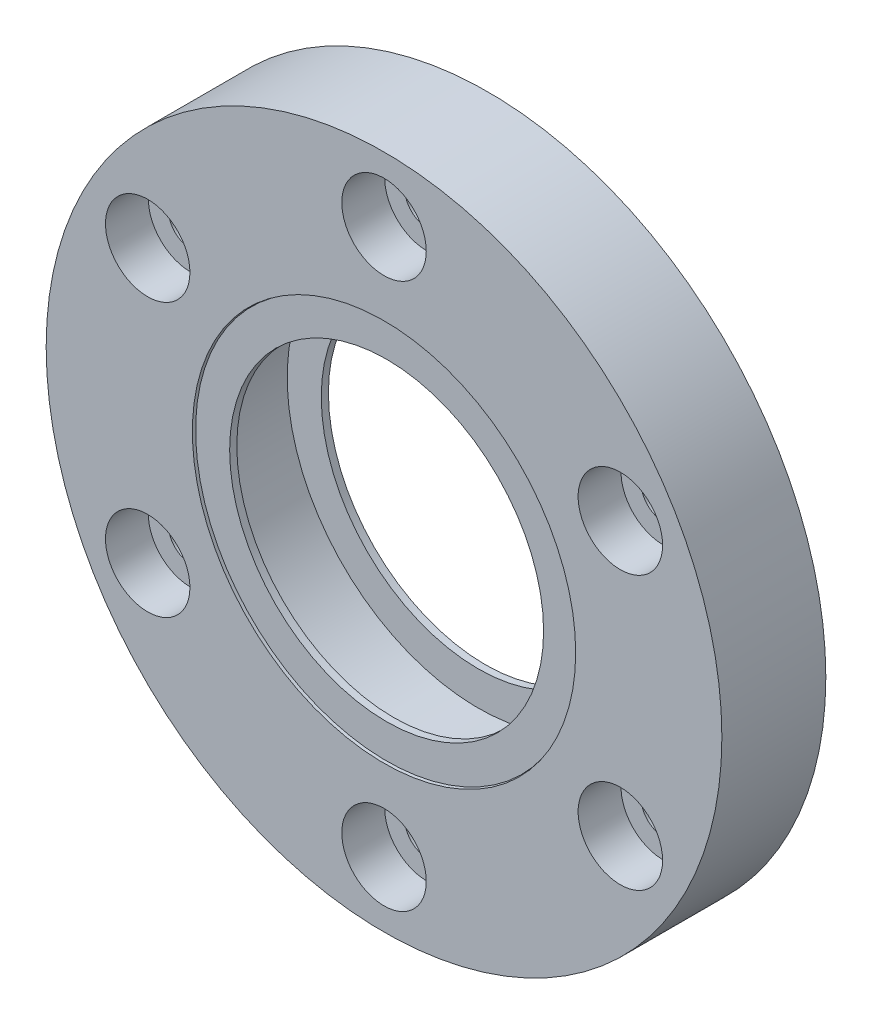
ISO-10303-21;
HEADER;
FILE_DESCRIPTION(('STEP AP214'),'2;1');
FILE_NAME('part.step','',(''),(''),'','','');
FILE_SCHEMA(('AUTOMOTIVE_DESIGN { 1 0 10303 214 1 1 1 1 }'));
ENDSEC;
DATA;
#1=APPLICATION_CONTEXT('core data for automotive mechanical design processes');
#2=APPLICATION_PROTOCOL_DEFINITION('international standard','automotive_design',2000,#1);
#3=PRODUCT_CONTEXT('',#1,'mechanical');
#4=PRODUCT('Part','Part','',(#3));
#5=PRODUCT_RELATED_PRODUCT_CATEGORY('part','',(#4));
#6=PRODUCT_DEFINITION_FORMATION('','',#4);
#7=PRODUCT_DEFINITION_CONTEXT('part definition',#1,'design');
#8=PRODUCT_DEFINITION('design','',#6,#7);
#9=PRODUCT_DEFINITION_SHAPE('','',#8);
#10=(LENGTH_UNIT() NAMED_UNIT(*) SI_UNIT(.MILLI.,.METRE.));
#11=(NAMED_UNIT(*) PLANE_ANGLE_UNIT() SI_UNIT($,.RADIAN.));
#12=(NAMED_UNIT(*) SI_UNIT($,.STERADIAN.) SOLID_ANGLE_UNIT());
#13=UNCERTAINTY_MEASURE_WITH_UNIT(LENGTH_MEASURE(1.E-05),#10,'distance_accuracy_value','');
#14=(GEOMETRIC_REPRESENTATION_CONTEXT(3) GLOBAL_UNCERTAINTY_ASSIGNED_CONTEXT((#13)) GLOBAL_UNIT_ASSIGNED_CONTEXT((#10,
#11,#12)) REPRESENTATION_CONTEXT('',''));
#15=CARTESIAN_POINT('',(0.,0.,0.));
#16=DIRECTION('',(0.,0.,1.));
#17=DIRECTION('',(1.,0.,0.));
#18=AXIS2_PLACEMENT_3D('',#15,#16,#17);
#19=CARTESIAN_POINT('',(0.,0.,0.75));
#20=DIRECTION('',(0.,0.,1.));
#21=DIRECTION('',(1.,0.,0.));
#22=AXIS2_PLACEMENT_3D('',#19,#20,#21);
#23=PLANE('',#22);
#24=CARTESIAN_POINT('',(0.,0.,0.75));
#25=DIRECTION('',(0.,0.,1.));
#26=DIRECTION('',(1.,0.,0.));
#27=AXIS2_PLACEMENT_3D('',#24,#25,#26);
#28=CIRCLE('',#27,14.7);
#29=CARTESIAN_POINT('',(14.7,0.,0.75));
#30=VERTEX_POINT('',#29);
#31=EDGE_CURVE('E11',#30,#30,#28,.T.);
#32=ORIENTED_EDGE('',*,*,#31,.T.);
#33=EDGE_LOOP('',(#32));
#34=FACE_BOUND('',#33,.T.);
#35=CARTESIAN_POINT('',(0.,0.,0.75));
#36=DIRECTION('',(0.,0.,1.));
#37=DIRECTION('',(1.,0.,0.));
#38=AXIS2_PLACEMENT_3D('',#35,#36,#37);
#39=CIRCLE('',#38,12.08);
#40=CARTESIAN_POINT('',(12.08,0.,0.75));
#41=VERTEX_POINT('',#40);
#42=EDGE_CURVE('E62',#41,#41,#39,.T.);
#43=ORIENTED_EDGE('',*,*,#42,.F.);
#44=EDGE_LOOP('',(#43));
#45=FACE_BOUND('',#44,.T.);
#46=ADVANCED_FACE('F53',(#34,#45),#23,.T.);
#47=CARTESIAN_POINT('',(0.,0.,0.2));
#48=DIRECTION('',(0.,0.,1.));
#49=DIRECTION('',(1.,0.,0.));
#50=AXIS2_PLACEMENT_3D('',#47,#48,#49);
#51=PLANE('',#50);
#52=CARTESIAN_POINT('',(0.,0.,0.2));
#53=DIRECTION('',(0.,0.,1.));
#54=DIRECTION('',(1.,0.,0.));
#55=AXIS2_PLACEMENT_3D('',#52,#53,#54);
#56=CIRCLE('',#55,14.7);
#57=CARTESIAN_POINT('',(14.7,0.,0.2));
#58=VERTEX_POINT('',#57);
#59=EDGE_CURVE('E59',#58,#58,#56,.T.);
#60=ORIENTED_EDGE('',*,*,#59,.F.);
#61=EDGE_LOOP('',(#60));
#62=FACE_BOUND('',#61,.T.);
#63=CARTESIAN_POINT('',(0.,0.,0.2));
#64=DIRECTION('',(0.,0.,1.));
#65=DIRECTION('',(1.,0.,0.));
#66=AXIS2_PLACEMENT_3D('',#63,#64,#65);
#67=CIRCLE('',#66,12.08);
#68=CARTESIAN_POINT('',(12.08,0.,0.2));
#69=VERTEX_POINT('',#68);
#70=EDGE_CURVE('E69',#69,#69,#67,.T.);
#71=ORIENTED_EDGE('',*,*,#70,.T.);
#72=EDGE_LOOP('',(#71));
#73=FACE_BOUND('',#72,.T.);
#74=ADVANCED_FACE('F80',(#62,#73),#51,.F.);
#75=CARTESIAN_POINT('',(0.,0.,0.75));
#76=DIRECTION('',(0.,0.,-1.));
#77=DIRECTION('',(-1.,0.,0.));
#78=AXIS2_PLACEMENT_3D('',#75,#76,#77);
#79=CYLINDRICAL_SURFACE('',#78,14.7);
#80=ORIENTED_EDGE('',*,*,#31,.F.);
#81=EDGE_LOOP('',(#80));
#82=FACE_BOUND('',#81,.T.);
#83=ORIENTED_EDGE('',*,*,#59,.T.);
#84=EDGE_LOOP('',(#83));
#85=FACE_BOUND('',#84,.T.);
#86=ADVANCED_FACE('F57',(#82,#85),#79,.T.);
#87=CARTESIAN_POINT('',(0.,0.,0.75));
#88=DIRECTION('',(0.,0.,-1.));
#89=DIRECTION('',(-1.,0.,0.));
#90=AXIS2_PLACEMENT_3D('',#87,#88,#89);
#91=CYLINDRICAL_SURFACE('',#90,12.08);
#92=ORIENTED_EDGE('',*,*,#42,.T.);
#93=EDGE_LOOP('',(#92));
#94=FACE_BOUND('',#93,.T.);
#95=ORIENTED_EDGE('',*,*,#70,.F.);
#96=EDGE_LOOP('',(#95));
#97=FACE_BOUND('',#96,.T.);
#98=ADVANCED_FACE('F72',(#94,#97),#91,.F.);
#99=CLOSED_SHELL('',(#46,#74,#86,#98));
#100=MANIFOLD_SOLID_BREP('B2',#99);
#101=CARTESIAN_POINT('',(0.,0.,7.8));
#102=DIRECTION('',(0.,0.,1.));
#103=DIRECTION('',(1.,0.,0.));
#104=AXIS2_PLACEMENT_3D('',#101,#102,#103);
#105=PLANE('',#104);
#106=CARTESIAN_POINT('',(0.,0.,7.8));
#107=DIRECTION('',(0.,0.,1.));
#108=DIRECTION('',(1.,0.,0.));
#109=AXIS2_PLACEMENT_3D('',#106,#107,#108);
#110=CIRCLE('',#109,14.7);
#111=CARTESIAN_POINT('',(14.7,0.,7.8));
#112=VERTEX_POINT('',#111);
#113=EDGE_CURVE('E52',#112,#112,#110,.T.);
#114=ORIENTED_EDGE('',*,*,#113,.T.);
#115=EDGE_LOOP('',(#114));
#116=FACE_BOUND('',#115,.T.);
#117=CARTESIAN_POINT('',(0.,0.,7.8));
#118=DIRECTION('',(0.,0.,1.));
#119=DIRECTION('',(1.,0.,0.));
#120=AXIS2_PLACEMENT_3D('',#117,#118,#119);
#121=CIRCLE('',#120,12.08);
#122=CARTESIAN_POINT('',(12.08,0.,7.8));
#123=VERTEX_POINT('',#122);
#124=EDGE_CURVE('E147',#123,#123,#121,.T.);
#125=ORIENTED_EDGE('',*,*,#124,.F.);
#126=EDGE_LOOP('',(#125));
#127=FACE_BOUND('',#126,.T.);
#128=ADVANCED_FACE('F138',(#116,#127),#105,.T.);
#129=CARTESIAN_POINT('',(0.,0.,7.25));
#130=DIRECTION('',(0.,0.,1.));
#131=DIRECTION('',(1.,0.,0.));
#132=AXIS2_PLACEMENT_3D('',#129,#130,#131);
#133=PLANE('',#132);
#134=CARTESIAN_POINT('',(0.,0.,7.25));
#135=DIRECTION('',(0.,0.,1.));
#136=DIRECTION('',(1.,0.,0.));
#137=AXIS2_PLACEMENT_3D('',#134,#135,#136);
#138=CIRCLE('',#137,14.7);
#139=CARTESIAN_POINT('',(14.7,0.,7.25));
#140=VERTEX_POINT('',#139);
#141=EDGE_CURVE('E141',#140,#140,#138,.T.);
#142=ORIENTED_EDGE('',*,*,#141,.F.);
#143=EDGE_LOOP('',(#142));
#144=FACE_BOUND('',#143,.T.);
#145=CARTESIAN_POINT('',(0.,0.,7.25));
#146=DIRECTION('',(0.,0.,1.));
#147=DIRECTION('',(1.,0.,0.));
#148=AXIS2_PLACEMENT_3D('',#145,#146,#147);
#149=CIRCLE('',#148,12.08);
#150=CARTESIAN_POINT('',(12.08,0.,7.25));
#151=VERTEX_POINT('',#150);
#152=EDGE_CURVE('E154',#151,#151,#149,.T.);
#153=ORIENTED_EDGE('',*,*,#152,.T.);
#154=EDGE_LOOP('',(#153));
#155=FACE_BOUND('',#154,.T.);
#156=ADVANCED_FACE('F162',(#144,#155),#133,.F.);
#157=CARTESIAN_POINT('',(0.,0.,7.8));
#158=DIRECTION('',(0.,0.,-1.));
#159=DIRECTION('',(-1.,0.,0.));
#160=AXIS2_PLACEMENT_3D('',#157,#158,#159);
#161=CYLINDRICAL_SURFACE('',#160,14.7);
#162=ORIENTED_EDGE('',*,*,#113,.F.);
#163=EDGE_LOOP('',(#162));
#164=FACE_BOUND('',#163,.T.);
#165=ORIENTED_EDGE('',*,*,#141,.T.);
#166=EDGE_LOOP('',(#165));
#167=FACE_BOUND('',#166,.T.);
#168=ADVANCED_FACE('F142',(#164,#167),#161,.T.);
#169=CARTESIAN_POINT('',(0.,0.,7.8));
#170=DIRECTION('',(0.,0.,-1.));
#171=DIRECTION('',(-1.,0.,0.));
#172=AXIS2_PLACEMENT_3D('',#169,#170,#171);
#173=CYLINDRICAL_SURFACE('',#172,12.08);
#174=ORIENTED_EDGE('',*,*,#124,.T.);
#175=EDGE_LOOP('',(#174));
#176=FACE_BOUND('',#175,.T.);
#177=ORIENTED_EDGE('',*,*,#152,.F.);
#178=EDGE_LOOP('',(#177));
#179=FACE_BOUND('',#178,.T.);
#180=ADVANCED_FACE('F157',(#176,#179),#173,.F.);
#181=CLOSED_SHELL('',(#128,#156,#168,#180));
#182=MANIFOLD_SOLID_BREP('B6',#181);
#183=CARTESIAN_POINT('',(0.,0.,8.));
#184=DIRECTION('',(0.,0.,1.));
#185=DIRECTION('',(1.,0.,0.));
#186=AXIS2_PLACEMENT_3D('',#183,#184,#185);
#187=PLANE('',#186);
#188=CARTESIAN_POINT('',(18.1865334794732,10.5,8.));
#189=DIRECTION('',(0.,0.,1.));
#190=DIRECTION('',(1.,0.,0.));
#191=AXIS2_PLACEMENT_3D('',#188,#189,#190);
#192=CIRCLE('',#191,3.25);
#193=CARTESIAN_POINT('',(21.4365334794732,10.5,8.));
#194=VERTEX_POINT('',#193);
#195=EDGE_CURVE('E302',#194,#194,#192,.T.);
#196=ORIENTED_EDGE('',*,*,#195,.F.);
#197=EDGE_LOOP('',(#196));
#198=FACE_BOUND('',#197,.T.);
#199=CARTESIAN_POINT('',(18.1865334794732,-10.5,8.));
#200=DIRECTION('',(0.,0.,1.));
#201=DIRECTION('',(1.,0.,0.));
#202=AXIS2_PLACEMENT_3D('',#199,#200,#201);
#203=CIRCLE('',#202,3.25);
#204=CARTESIAN_POINT('',(21.4365334794732,-10.5,8.));
#205=VERTEX_POINT('',#204);
#206=EDGE_CURVE('E292',#205,#205,#203,.T.);
#207=ORIENTED_EDGE('',*,*,#206,.F.);
#208=EDGE_LOOP('',(#207));
#209=FACE_BOUND('',#208,.T.);
#210=CARTESIAN_POINT('',(0.,-21.,8.));
#211=DIRECTION('',(0.,0.,1.));
#212=DIRECTION('',(1.,0.,0.));
#213=AXIS2_PLACEMENT_3D('',#210,#211,#212);
#214=CIRCLE('',#213,3.25);
#215=CARTESIAN_POINT('',(3.24999999999999,-21.,8.));
#216=VERTEX_POINT('',#215);
#217=EDGE_CURVE('E277',#216,#216,#214,.T.);
#218=ORIENTED_EDGE('',*,*,#217,.F.);
#219=EDGE_LOOP('',(#218));
#220=FACE_BOUND('',#219,.T.);
#221=CARTESIAN_POINT('',(-18.1865334794732,-10.5,8.));
#222=DIRECTION('',(0.,0.,1.));
#223=DIRECTION('',(1.,0.,0.));
#224=AXIS2_PLACEMENT_3D('',#221,#222,#223);
#225=CIRCLE('',#224,3.25);
#226=CARTESIAN_POINT('',(-14.9365334794732,-10.5,8.));
#227=VERTEX_POINT('',#226);
#228=EDGE_CURVE('E267',#227,#227,#225,.T.);
#229=ORIENTED_EDGE('',*,*,#228,.F.);
#230=EDGE_LOOP('',(#229));
#231=FACE_BOUND('',#230,.T.);
#232=CARTESIAN_POINT('',(-18.1865334794732,10.5,8.));
#233=DIRECTION('',(0.,0.,1.));
#234=DIRECTION('',(1.,0.,0.));
#235=AXIS2_PLACEMENT_3D('',#232,#233,#234);
#236=CIRCLE('',#235,3.25);
#237=CARTESIAN_POINT('',(-14.9365334794732,10.5,8.));
#238=VERTEX_POINT('',#237);
#239=EDGE_CURVE('E259',#238,#238,#236,.T.);
#240=ORIENTED_EDGE('',*,*,#239,.F.);
#241=EDGE_LOOP('',(#240));
#242=FACE_BOUND('',#241,.T.);
#243=CARTESIAN_POINT('',(0.,21.,8.));
#244=DIRECTION('',(0.,0.,1.));
#245=DIRECTION('',(1.,0.,0.));
#246=AXIS2_PLACEMENT_3D('',#243,#244,#245);
#247=CIRCLE('',#246,3.25);
#248=CARTESIAN_POINT('',(3.25,21.,8.));
#249=VERTEX_POINT('',#248);
#250=EDGE_CURVE('E242',#249,#249,#247,.T.);
#251=ORIENTED_EDGE('',*,*,#250,.F.);
#252=EDGE_LOOP('',(#251));
#253=FACE_BOUND('',#252,.T.);
#254=CARTESIAN_POINT('',(0.,0.,8.));
#255=DIRECTION('',(0.,0.,1.));
#256=DIRECTION('',(1.,0.,0.));
#257=AXIS2_PLACEMENT_3D('',#254,#255,#256);
#258=CIRCLE('',#257,26.);
#259=CARTESIAN_POINT('',(26.,0.,8.));
#260=VERTEX_POINT('',#259);
#261=EDGE_CURVE('E137',#260,#260,#258,.T.);
#262=ORIENTED_EDGE('',*,*,#261,.T.);
#263=EDGE_LOOP('',(#262));
#264=FACE_BOUND('',#263,.T.);
#265=CARTESIAN_POINT('',(0.,0.,8.));
#266=DIRECTION('',(0.,0.,1.));
#267=DIRECTION('',(1.,0.,0.));
#268=AXIS2_PLACEMENT_3D('',#265,#266,#267);
#269=CIRCLE('',#268,14.75);
#270=CARTESIAN_POINT('',(14.75,0.,8.));
#271=VERTEX_POINT('',#270);
#272=EDGE_CURVE('E226',#271,#271,#269,.T.);
#273=ORIENTED_EDGE('',*,*,#272,.F.);
#274=EDGE_LOOP('',(#273));
#275=FACE_BOUND('',#274,.T.);
#276=ADVANCED_FACE('F219',(#198,#209,#220,#231,#242,#253,#264,#275),#187,.T.);
#277=CARTESIAN_POINT('',(0.,0.,0.));
#278=DIRECTION('',(0.,0.,1.));
#279=DIRECTION('',(1.,0.,0.));
#280=AXIS2_PLACEMENT_3D('',#277,#278,#279);
#281=PLANE('',#280);
#282=CARTESIAN_POINT('',(18.1865334794732,10.5,0.));
#283=DIRECTION('',(0.,0.,1.));
#284=DIRECTION('',(1.,0.,0.));
#285=AXIS2_PLACEMENT_3D('',#282,#283,#284);
#286=CIRCLE('',#285,1.70000000000001);
#287=CARTESIAN_POINT('',(19.8865334794732,10.5,0.));
#288=VERTEX_POINT('',#287);
#289=EDGE_CURVE('E294',#288,#288,#286,.T.);
#290=ORIENTED_EDGE('',*,*,#289,.T.);
#291=EDGE_LOOP('',(#290));
#292=FACE_BOUND('',#291,.T.);
#293=CARTESIAN_POINT('',(18.1865334794732,-10.5,0.));
#294=DIRECTION('',(0.,0.,1.));
#295=DIRECTION('',(1.,0.,0.));
#296=AXIS2_PLACEMENT_3D('',#293,#294,#295);
#297=CIRCLE('',#296,1.70000000000001);
#298=CARTESIAN_POINT('',(19.8865334794732,-10.5,0.));
#299=VERTEX_POINT('',#298);
#300=EDGE_CURVE('E285',#299,#299,#297,.T.);
#301=ORIENTED_EDGE('',*,*,#300,.T.);
#302=EDGE_LOOP('',(#301));
#303=FACE_BOUND('',#302,.T.);
#304=CARTESIAN_POINT('',(0.,-21.,0.));
#305=DIRECTION('',(0.,0.,1.));
#306=DIRECTION('',(1.,0.,0.));
#307=AXIS2_PLACEMENT_3D('',#304,#305,#306);
#308=CIRCLE('',#307,1.70000000000001);
#309=CARTESIAN_POINT('',(1.70000000000001,-21.,0.));
#310=VERTEX_POINT('',#309);
#311=EDGE_CURVE('E272',#310,#310,#308,.T.);
#312=ORIENTED_EDGE('',*,*,#311,.T.);
#313=EDGE_LOOP('',(#312));
#314=FACE_BOUND('',#313,.T.);
#315=CARTESIAN_POINT('',(-18.1865334794732,-10.5,0.));
#316=DIRECTION('',(0.,0.,1.));
#317=DIRECTION('',(1.,0.,0.));
#318=AXIS2_PLACEMENT_3D('',#315,#316,#317);
#319=CIRCLE('',#318,1.70000000000001);
#320=CARTESIAN_POINT('',(-16.4865334794732,-10.5,0.));
#321=VERTEX_POINT('',#320);
#322=EDGE_CURVE('E258',#321,#321,#319,.T.);
#323=ORIENTED_EDGE('',*,*,#322,.T.);
#324=EDGE_LOOP('',(#323));
#325=FACE_BOUND('',#324,.T.);
#326=CARTESIAN_POINT('',(-18.1865334794732,10.5,0.));
#327=DIRECTION('',(0.,0.,1.));
#328=DIRECTION('',(1.,0.,0.));
#329=AXIS2_PLACEMENT_3D('',#326,#327,#328);
#330=CIRCLE('',#329,1.70000000000001);
#331=CARTESIAN_POINT('',(-16.4865334794732,10.5,0.));
#332=VERTEX_POINT('',#331);
#333=EDGE_CURVE('E250',#332,#332,#330,.T.);
#334=ORIENTED_EDGE('',*,*,#333,.T.);
#335=EDGE_LOOP('',(#334));
#336=FACE_BOUND('',#335,.T.);
#337=CARTESIAN_POINT('',(0.,21.,0.));
#338=DIRECTION('',(0.,0.,1.));
#339=DIRECTION('',(1.,0.,0.));
#340=AXIS2_PLACEMENT_3D('',#337,#338,#339);
#341=CIRCLE('',#340,1.70000000000001);
#342=CARTESIAN_POINT('',(1.70000000000001,21.,0.));
#343=VERTEX_POINT('',#342);
#344=EDGE_CURVE('E231',#343,#343,#341,.T.);
#345=ORIENTED_EDGE('',*,*,#344,.T.);
#346=EDGE_LOOP('',(#345));
#347=FACE_BOUND('',#346,.T.);
#348=CARTESIAN_POINT('',(0.,0.,0.));
#349=DIRECTION('',(0.,0.,1.));
#350=DIRECTION('',(1.,0.,0.));
#351=AXIS2_PLACEMENT_3D('',#348,#349,#350);
#352=CIRCLE('',#351,26.);
#353=CARTESIAN_POINT('',(26.,0.,0.));
#354=VERTEX_POINT('',#353);
#355=EDGE_CURVE('E221',#354,#354,#352,.T.);
#356=ORIENTED_EDGE('',*,*,#355,.F.);
#357=EDGE_LOOP('',(#356));
#358=FACE_BOUND('',#357,.T.);
#359=CARTESIAN_POINT('',(0.,0.,0.));
#360=DIRECTION('',(0.,0.,1.));
#361=DIRECTION('',(1.,0.,0.));
#362=AXIS2_PLACEMENT_3D('',#359,#360,#361);
#363=CIRCLE('',#362,14.75);
#364=CARTESIAN_POINT('',(14.75,0.,0.));
#365=VERTEX_POINT('',#364);
#366=EDGE_CURVE('E229',#365,#365,#363,.T.);
#367=ORIENTED_EDGE('',*,*,#366,.T.);
#368=EDGE_LOOP('',(#367));
#369=FACE_BOUND('',#368,.T.);
#370=ADVANCED_FACE('F315',(#292,#303,#314,#325,#336,#347,#358,#369),#281,.F.);
#371=CARTESIAN_POINT('',(0.,0.,8.));
#372=DIRECTION('',(0.,0.,-1.));
#373=DIRECTION('',(-1.,0.,0.));
#374=AXIS2_PLACEMENT_3D('',#371,#372,#373);
#375=CYLINDRICAL_SURFACE('',#374,26.);
#376=ORIENTED_EDGE('',*,*,#261,.F.);
#377=EDGE_LOOP('',(#376));
#378=FACE_BOUND('',#377,.T.);
#379=ORIENTED_EDGE('',*,*,#355,.T.);
#380=EDGE_LOOP('',(#379));
#381=FACE_BOUND('',#380,.T.);
#382=ADVANCED_FACE('F216',(#378,#381),#375,.T.);
#383=CARTESIAN_POINT('',(0.,0.,8.));
#384=DIRECTION('',(0.,0.,-1.));
#385=DIRECTION('',(-1.,0.,0.));
#386=AXIS2_PLACEMENT_3D('',#383,#384,#385);
#387=CYLINDRICAL_SURFACE('',#386,14.75);
#388=ORIENTED_EDGE('',*,*,#272,.T.);
#389=EDGE_LOOP('',(#388));
#390=FACE_BOUND('',#389,.T.);
#391=ORIENTED_EDGE('',*,*,#366,.F.);
#392=EDGE_LOOP('',(#391));
#393=FACE_BOUND('',#392,.T.);
#394=ADVANCED_FACE('F327',(#390,#393),#387,.F.);
#395=CARTESIAN_POINT('',(0.,21.,8.));
#396=DIRECTION('',(0.,0.,1.));
#397=DIRECTION('',(1.,0.,0.));
#398=AXIS2_PLACEMENT_3D('',#395,#396,#397);
#399=CYLINDRICAL_SURFACE('',#398,1.70000000000001);
#400=ORIENTED_EDGE('',*,*,#344,.F.);
#401=EDGE_LOOP('',(#400));
#402=FACE_BOUND('',#401,.T.);
#403=CARTESIAN_POINT('',(0.,21.,4.7));
#404=DIRECTION('',(0.,0.,1.));
#405=DIRECTION('',(1.,0.,0.));
#406=AXIS2_PLACEMENT_3D('',#403,#404,#405);
#407=CIRCLE('',#406,1.70000000000001);
#408=CARTESIAN_POINT('',(1.70000000000001,21.,4.7));
#409=VERTEX_POINT('',#408);
#410=EDGE_CURVE('E238',#409,#409,#407,.T.);
#411=ORIENTED_EDGE('',*,*,#410,.T.);
#412=EDGE_LOOP('',(#411));
#413=FACE_BOUND('',#412,.T.);
#414=ADVANCED_FACE('F326',(#402,#413),#399,.F.);
#415=CARTESIAN_POINT('',(1.70000000000001,21.,4.7));
#416=DIRECTION('',(0.,0.,-1.));
#417=DIRECTION('',(-1.,0.,0.));
#418=AXIS2_PLACEMENT_3D('',#415,#416,#417);
#419=PLANE('',#418);
#420=ORIENTED_EDGE('',*,*,#410,.F.);
#421=EDGE_LOOP('',(#420));
#422=FACE_BOUND('',#421,.T.);
#423=CARTESIAN_POINT('',(0.,21.,4.7));
#424=DIRECTION('',(0.,0.,1.));
#425=DIRECTION('',(1.,0.,0.));
#426=AXIS2_PLACEMENT_3D('',#423,#424,#425);
#427=CIRCLE('',#426,3.25);
#428=CARTESIAN_POINT('',(3.25,21.,4.7));
#429=VERTEX_POINT('',#428);
#430=EDGE_CURVE('E241',#429,#429,#427,.T.);
#431=ORIENTED_EDGE('',*,*,#430,.T.);
#432=EDGE_LOOP('',(#431));
#433=FACE_BOUND('',#432,.T.);
#434=ADVANCED_FACE('F345',(#422,#433),#419,.F.);
#435=CARTESIAN_POINT('',(0.,21.,8.));
#436=DIRECTION('',(0.,0.,1.));
#437=DIRECTION('',(1.,0.,0.));
#438=AXIS2_PLACEMENT_3D('',#435,#436,#437);
#439=CYLINDRICAL_SURFACE('',#438,3.25);
#440=ORIENTED_EDGE('',*,*,#430,.F.);
#441=EDGE_LOOP('',(#440));
#442=FACE_BOUND('',#441,.T.);
#443=ORIENTED_EDGE('',*,*,#250,.T.);
#444=EDGE_LOOP('',(#443));
#445=FACE_BOUND('',#444,.T.);
#446=ADVANCED_FACE('F349',(#442,#445),#439,.F.);
#447=CARTESIAN_POINT('',(-18.1865334794732,10.5,8.));
#448=DIRECTION('',(0.,0.,1.));
#449=DIRECTION('',(1.,0.,0.));
#450=AXIS2_PLACEMENT_3D('',#447,#448,#449);
#451=CYLINDRICAL_SURFACE('',#450,1.70000000000001);
#452=ORIENTED_EDGE('',*,*,#333,.F.);
#453=EDGE_LOOP('',(#452));
#454=FACE_BOUND('',#453,.T.);
#455=CARTESIAN_POINT('',(-18.1865334794732,10.5,4.7));
#456=DIRECTION('',(0.,0.,1.));
#457=DIRECTION('',(1.,0.,0.));
#458=AXIS2_PLACEMENT_3D('',#455,#456,#457);
#459=CIRCLE('',#458,1.70000000000001);
#460=CARTESIAN_POINT('',(-16.4865334794732,10.5,4.7));
#461=VERTEX_POINT('',#460);
#462=EDGE_CURVE('E249',#461,#461,#459,.T.);
#463=ORIENTED_EDGE('',*,*,#462,.T.);
#464=EDGE_LOOP('',(#463));
#465=FACE_BOUND('',#464,.T.);
#466=ADVANCED_FACE('F351',(#454,#465),#451,.F.);
#467=CARTESIAN_POINT('',(-16.4865334794732,10.5,4.7));
#468=DIRECTION('',(0.,0.,-1.));
#469=DIRECTION('',(-1.,0.,0.));
#470=AXIS2_PLACEMENT_3D('',#467,#468,#469);
#471=PLANE('',#470);
#472=ORIENTED_EDGE('',*,*,#462,.F.);
#473=EDGE_LOOP('',(#472));
#474=FACE_BOUND('',#473,.T.);
#475=CARTESIAN_POINT('',(-18.1865334794732,10.5,4.7));
#476=DIRECTION('',(0.,0.,1.));
#477=DIRECTION('',(1.,0.,0.));
#478=AXIS2_PLACEMENT_3D('',#475,#476,#477);
#479=CIRCLE('',#478,3.25);
#480=CARTESIAN_POINT('',(-14.9365334794732,10.5,4.7));
#481=VERTEX_POINT('',#480);
#482=EDGE_CURVE('E254',#481,#481,#479,.T.);
#483=ORIENTED_EDGE('',*,*,#482,.T.);
#484=EDGE_LOOP('',(#483));
#485=FACE_BOUND('',#484,.T.);
#486=ADVANCED_FACE('F354',(#474,#485),#471,.F.);
#487=CARTESIAN_POINT('',(-18.1865334794732,10.5,8.));
#488=DIRECTION('',(0.,0.,1.));
#489=DIRECTION('',(1.,0.,0.));
#490=AXIS2_PLACEMENT_3D('',#487,#488,#489);
#491=CYLINDRICAL_SURFACE('',#490,3.25);
#492=ORIENTED_EDGE('',*,*,#482,.F.);
#493=EDGE_LOOP('',(#492));
#494=FACE_BOUND('',#493,.T.);
#495=ORIENTED_EDGE('',*,*,#239,.T.);
#496=EDGE_LOOP('',(#495));
#497=FACE_BOUND('',#496,.T.);
#498=ADVANCED_FACE('F360',(#494,#497),#491,.F.);
#499=CARTESIAN_POINT('',(-18.1865334794732,-10.5,8.));
#500=DIRECTION('',(0.,0.,1.));
#501=DIRECTION('',(1.,0.,0.));
#502=AXIS2_PLACEMENT_3D('',#499,#500,#501);
#503=CYLINDRICAL_SURFACE('',#502,1.70000000000001);
#504=ORIENTED_EDGE('',*,*,#322,.F.);
#505=EDGE_LOOP('',(#504));
#506=FACE_BOUND('',#505,.T.);
#507=CARTESIAN_POINT('',(-18.1865334794732,-10.5,4.7));
#508=DIRECTION('',(0.,0.,1.));
#509=DIRECTION('',(1.,0.,0.));
#510=AXIS2_PLACEMENT_3D('',#507,#508,#509);
#511=CIRCLE('',#510,1.70000000000001);
#512=CARTESIAN_POINT('',(-16.4865334794732,-10.5,4.7));
#513=VERTEX_POINT('',#512);
#514=EDGE_CURVE('E264',#513,#513,#511,.T.);
#515=ORIENTED_EDGE('',*,*,#514,.T.);
#516=EDGE_LOOP('',(#515));
#517=FACE_BOUND('',#516,.T.);
#518=ADVANCED_FACE('F361',(#506,#517),#503,.F.);
#519=CARTESIAN_POINT('',(-16.4865334794732,-10.5,4.7));
#520=DIRECTION('',(0.,0.,-1.));
#521=DIRECTION('',(-1.,0.,0.));
#522=AXIS2_PLACEMENT_3D('',#519,#520,#521);
#523=PLANE('',#522);
#524=ORIENTED_EDGE('',*,*,#514,.F.);
#525=EDGE_LOOP('',(#524));
#526=FACE_BOUND('',#525,.T.);
#527=CARTESIAN_POINT('',(-18.1865334794732,-10.5,4.7));
#528=DIRECTION('',(0.,0.,1.));
#529=DIRECTION('',(1.,0.,0.));
#530=AXIS2_PLACEMENT_3D('',#527,#528,#529);
#531=CIRCLE('',#530,3.25);
#532=CARTESIAN_POINT('',(-14.9365334794732,-10.5,4.7));
#533=VERTEX_POINT('',#532);
#534=EDGE_CURVE('E263',#533,#533,#531,.T.);
#535=ORIENTED_EDGE('',*,*,#534,.T.);
#536=EDGE_LOOP('',(#535));
#537=FACE_BOUND('',#536,.T.);
#538=ADVANCED_FACE('F370',(#526,#537),#523,.F.);
#539=CARTESIAN_POINT('',(-18.1865334794732,-10.5,8.));
#540=DIRECTION('',(0.,0.,1.));
#541=DIRECTION('',(1.,0.,0.));
#542=AXIS2_PLACEMENT_3D('',#539,#540,#541);
#543=CYLINDRICAL_SURFACE('',#542,3.25);
#544=ORIENTED_EDGE('',*,*,#534,.F.);
#545=EDGE_LOOP('',(#544));
#546=FACE_BOUND('',#545,.T.);
#547=ORIENTED_EDGE('',*,*,#228,.T.);
#548=EDGE_LOOP('',(#547));
#549=FACE_BOUND('',#548,.T.);
#550=ADVANCED_FACE('F371',(#546,#549),#543,.F.);
#551=CARTESIAN_POINT('',(0.,-21.,8.));
#552=DIRECTION('',(0.,0.,1.));
#553=DIRECTION('',(1.,0.,0.));
#554=AXIS2_PLACEMENT_3D('',#551,#552,#553);
#555=CYLINDRICAL_SURFACE('',#554,1.70000000000001);
#556=ORIENTED_EDGE('',*,*,#311,.F.);
#557=EDGE_LOOP('',(#556));
#558=FACE_BOUND('',#557,.T.);
#559=CARTESIAN_POINT('',(0.,-21.,4.7));
#560=DIRECTION('',(0.,0.,1.));
#561=DIRECTION('',(1.,0.,0.));
#562=AXIS2_PLACEMENT_3D('',#559,#560,#561);
#563=CIRCLE('',#562,1.70000000000001);
#564=CARTESIAN_POINT('',(1.70000000000001,-21.,4.7));
#565=VERTEX_POINT('',#564);
#566=EDGE_CURVE('E274',#565,#565,#563,.T.);
#567=ORIENTED_EDGE('',*,*,#566,.T.);
#568=EDGE_LOOP('',(#567));
#569=FACE_BOUND('',#568,.T.);
#570=ADVANCED_FACE('F374',(#558,#569),#555,.F.);
#571=CARTESIAN_POINT('',(1.70000000000001,-21.,4.7));
#572=DIRECTION('',(0.,0.,-1.));
#573=DIRECTION('',(-1.,0.,0.));
#574=AXIS2_PLACEMENT_3D('',#571,#572,#573);
#575=PLANE('',#574);
#576=ORIENTED_EDGE('',*,*,#566,.F.);
#577=EDGE_LOOP('',(#576));
#578=FACE_BOUND('',#577,.T.);
#579=CARTESIAN_POINT('',(0.,-21.,4.7));
#580=DIRECTION('',(0.,0.,1.));
#581=DIRECTION('',(1.,0.,0.));
#582=AXIS2_PLACEMENT_3D('',#579,#580,#581);
#583=CIRCLE('',#582,3.25);
#584=CARTESIAN_POINT('',(3.24999999999999,-21.,4.7));
#585=VERTEX_POINT('',#584);
#586=EDGE_CURVE('E276',#585,#585,#583,.T.);
#587=ORIENTED_EDGE('',*,*,#586,.T.);
#588=EDGE_LOOP('',(#587));
#589=FACE_BOUND('',#588,.T.);
#590=ADVANCED_FACE('F378',(#578,#589),#575,.F.);
#591=CARTESIAN_POINT('',(0.,-21.,8.));
#592=DIRECTION('',(0.,0.,1.));
#593=DIRECTION('',(1.,0.,0.));
#594=AXIS2_PLACEMENT_3D('',#591,#592,#593);
#595=CYLINDRICAL_SURFACE('',#594,3.25);
#596=ORIENTED_EDGE('',*,*,#586,.F.);
#597=EDGE_LOOP('',(#596));
#598=FACE_BOUND('',#597,.T.);
#599=ORIENTED_EDGE('',*,*,#217,.T.);
#600=EDGE_LOOP('',(#599));
#601=FACE_BOUND('',#600,.T.);
#602=ADVANCED_FACE('F384',(#598,#601),#595,.F.);
#603=CARTESIAN_POINT('',(18.1865334794732,-10.5,8.));
#604=DIRECTION('',(0.,0.,1.));
#605=DIRECTION('',(1.,0.,0.));
#606=AXIS2_PLACEMENT_3D('',#603,#604,#605);
#607=CYLINDRICAL_SURFACE('',#606,1.70000000000001);
#608=ORIENTED_EDGE('',*,*,#300,.F.);
#609=EDGE_LOOP('',(#608));
#610=FACE_BOUND('',#609,.T.);
#611=CARTESIAN_POINT('',(18.1865334794732,-10.5,4.7));
#612=DIRECTION('',(0.,0.,1.));
#613=DIRECTION('',(1.,0.,0.));
#614=AXIS2_PLACEMENT_3D('',#611,#612,#613);
#615=CIRCLE('',#614,1.70000000000001);
#616=CARTESIAN_POINT('',(19.8865334794732,-10.5,4.7));
#617=VERTEX_POINT('',#616);
#618=EDGE_CURVE('E286',#617,#617,#615,.T.);
#619=ORIENTED_EDGE('',*,*,#618,.T.);
#620=EDGE_LOOP('',(#619));
#621=FACE_BOUND('',#620,.T.);
#622=ADVANCED_FACE('F386',(#610,#621),#607,.F.);
#623=CARTESIAN_POINT('',(19.8865334794732,-10.5,4.7));
#624=DIRECTION('',(0.,0.,-1.));
#625=DIRECTION('',(-1.,0.,0.));
#626=AXIS2_PLACEMENT_3D('',#623,#624,#625);
#627=PLANE('',#626);
#628=ORIENTED_EDGE('',*,*,#618,.F.);
#629=EDGE_LOOP('',(#628));
#630=FACE_BOUND('',#629,.T.);
#631=CARTESIAN_POINT('',(18.1865334794732,-10.5,4.7));
#632=DIRECTION('',(0.,0.,1.));
#633=DIRECTION('',(1.,0.,0.));
#634=AXIS2_PLACEMENT_3D('',#631,#632,#633);
#635=CIRCLE('',#634,3.25);
#636=CARTESIAN_POINT('',(21.4365334794732,-10.5,4.7));
#637=VERTEX_POINT('',#636);
#638=EDGE_CURVE('E288',#637,#637,#635,.T.);
#639=ORIENTED_EDGE('',*,*,#638,.T.);
#640=EDGE_LOOP('',(#639));
#641=FACE_BOUND('',#640,.T.);
#642=ADVANCED_FACE('F392',(#630,#641),#627,.F.);
#643=CARTESIAN_POINT('',(18.1865334794732,-10.5,8.));
#644=DIRECTION('',(0.,0.,1.));
#645=DIRECTION('',(1.,0.,0.));
#646=AXIS2_PLACEMENT_3D('',#643,#644,#645);
#647=CYLINDRICAL_SURFACE('',#646,3.25);
#648=ORIENTED_EDGE('',*,*,#638,.F.);
#649=EDGE_LOOP('',(#648));
#650=FACE_BOUND('',#649,.T.);
#651=ORIENTED_EDGE('',*,*,#206,.T.);
#652=EDGE_LOOP('',(#651));
#653=FACE_BOUND('',#652,.T.);
#654=ADVANCED_FACE('F393',(#650,#653),#647,.F.);
#655=CARTESIAN_POINT('',(18.1865334794732,10.5,8.));
#656=DIRECTION('',(0.,0.,1.));
#657=DIRECTION('',(1.,0.,0.));
#658=AXIS2_PLACEMENT_3D('',#655,#656,#657);
#659=CYLINDRICAL_SURFACE('',#658,1.70000000000001);
#660=ORIENTED_EDGE('',*,*,#289,.F.);
#661=EDGE_LOOP('',(#660));
#662=FACE_BOUND('',#661,.T.);
#663=CARTESIAN_POINT('',(18.1865334794732,10.5,4.7));
#664=DIRECTION('',(0.,0.,1.));
#665=DIRECTION('',(1.,0.,0.));
#666=AXIS2_PLACEMENT_3D('',#663,#664,#665);
#667=CIRCLE('',#666,1.70000000000001);
#668=CARTESIAN_POINT('',(19.8865334794732,10.5,4.7));
#669=VERTEX_POINT('',#668);
#670=EDGE_CURVE('E296',#669,#669,#667,.T.);
#671=ORIENTED_EDGE('',*,*,#670,.T.);
#672=EDGE_LOOP('',(#671));
#673=FACE_BOUND('',#672,.T.);
#674=ADVANCED_FACE('F398',(#662,#673),#659,.F.);
#675=CARTESIAN_POINT('',(19.8865334794732,10.5,4.7));
#676=DIRECTION('',(0.,0.,-1.));
#677=DIRECTION('',(-1.,0.,0.));
#678=AXIS2_PLACEMENT_3D('',#675,#676,#677);
#679=PLANE('',#678);
#680=ORIENTED_EDGE('',*,*,#670,.F.);
#681=EDGE_LOOP('',(#680));
#682=FACE_BOUND('',#681,.T.);
#683=CARTESIAN_POINT('',(18.1865334794732,10.5,4.7));
#684=DIRECTION('',(0.,0.,1.));
#685=DIRECTION('',(1.,0.,0.));
#686=AXIS2_PLACEMENT_3D('',#683,#684,#685);
#687=CIRCLE('',#686,3.25);
#688=CARTESIAN_POINT('',(21.4365334794732,10.5,4.7));
#689=VERTEX_POINT('',#688);
#690=EDGE_CURVE('E301',#689,#689,#687,.T.);
#691=ORIENTED_EDGE('',*,*,#690,.T.);
#692=EDGE_LOOP('',(#691));
#693=FACE_BOUND('',#692,.T.);
#694=ADVANCED_FACE('F401',(#682,#693),#679,.F.);
#695=CARTESIAN_POINT('',(18.1865334794732,10.5,8.));
#696=DIRECTION('',(0.,0.,1.));
#697=DIRECTION('',(1.,0.,0.));
#698=AXIS2_PLACEMENT_3D('',#695,#696,#697);
#699=CYLINDRICAL_SURFACE('',#698,3.25);
#700=ORIENTED_EDGE('',*,*,#690,.F.);
#701=EDGE_LOOP('',(#700));
#702=FACE_BOUND('',#701,.T.);
#703=ORIENTED_EDGE('',*,*,#195,.T.);
#704=EDGE_LOOP('',(#703));
#705=FACE_BOUND('',#704,.T.);
#706=ADVANCED_FACE('F308',(#702,#705),#699,.F.);
#707=CLOSED_SHELL('',(#276,#370,#382,#394,#414,#434,#446,#466,#486,#498,#518,#538,#550,#570,
#590,#602,#622,#642,#654,#674,#694,#706));
#708=MANIFOLD_SOLID_BREP('B48',#707);
#709=ADVANCED_BREP_SHAPE_REPRESENTATION('',(#18,#100,#182,#708),#14);
#710=SHAPE_DEFINITION_REPRESENTATION(#9,#709);
ENDSEC;
END-ISO-10303-21;
